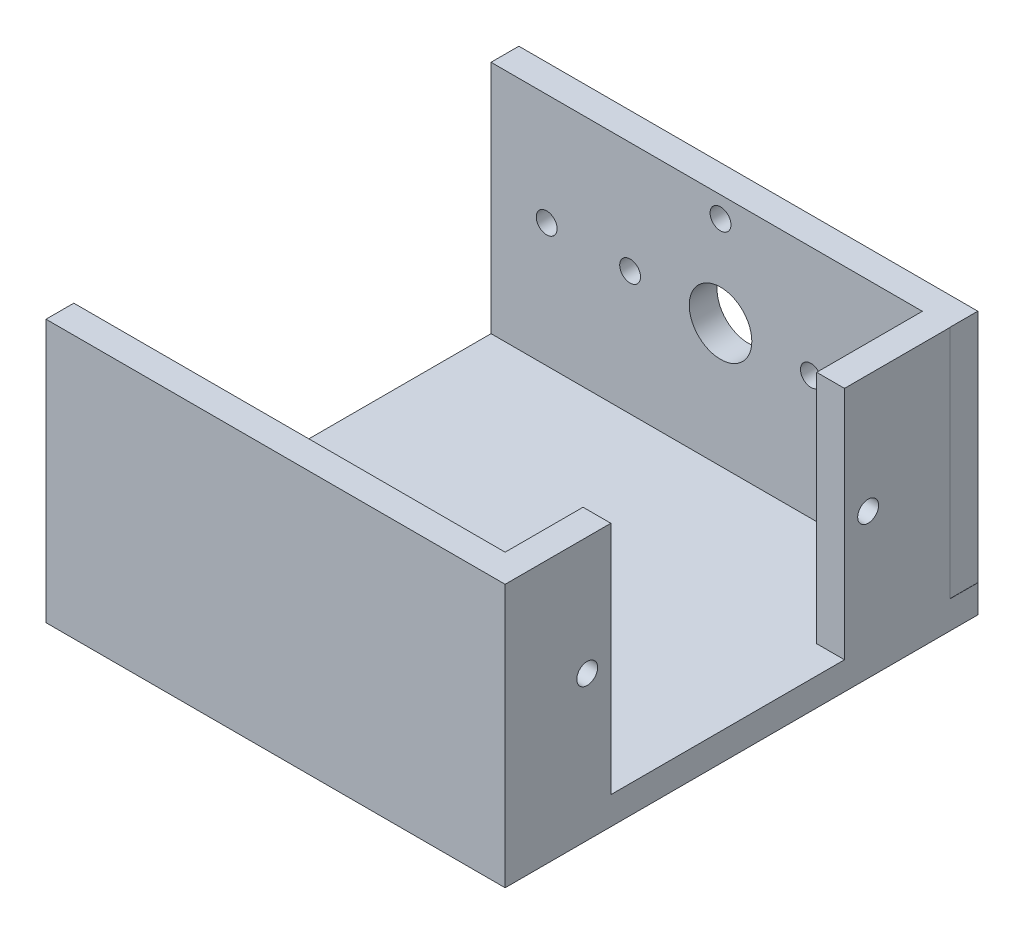
ISO-10303-21;
HEADER;
FILE_DESCRIPTION(('STEP AP214'),'2;1');
FILE_NAME('part.step','',(''),(''),'','','');
FILE_SCHEMA(('AUTOMOTIVE_DESIGN { 1 0 10303 214 1 1 1 1 }'));
ENDSEC;
DATA;
#1=APPLICATION_CONTEXT('core data for automotive mechanical design processes');
#2=APPLICATION_PROTOCOL_DEFINITION('international standard','automotive_design',2000,#1);
#3=PRODUCT_CONTEXT('',#1,'mechanical');
#4=PRODUCT('Part','Part','',(#3));
#5=PRODUCT_RELATED_PRODUCT_CATEGORY('part','',(#4));
#6=PRODUCT_DEFINITION_FORMATION('','',#4);
#7=PRODUCT_DEFINITION_CONTEXT('part definition',#1,'design');
#8=PRODUCT_DEFINITION('design','',#6,#7);
#9=PRODUCT_DEFINITION_SHAPE('','',#8);
#10=(LENGTH_UNIT() NAMED_UNIT(*) SI_UNIT(.MILLI.,.METRE.));
#11=(NAMED_UNIT(*) PLANE_ANGLE_UNIT() SI_UNIT($,.RADIAN.));
#12=(NAMED_UNIT(*) SI_UNIT($,.STERADIAN.) SOLID_ANGLE_UNIT());
#13=UNCERTAINTY_MEASURE_WITH_UNIT(LENGTH_MEASURE(1.E-05),#10,'distance_accuracy_value','');
#14=(GEOMETRIC_REPRESENTATION_CONTEXT(3) GLOBAL_UNCERTAINTY_ASSIGNED_CONTEXT((#13)) GLOBAL_UNIT_ASSIGNED_CONTEXT((#10,
#11,#12)) REPRESENTATION_CONTEXT('',''));
#15=CARTESIAN_POINT('',(0.,0.,0.));
#16=DIRECTION('',(0.,0.,1.));
#17=DIRECTION('',(1.,0.,0.));
#18=AXIS2_PLACEMENT_3D('',#15,#16,#17);
#19=CARTESIAN_POINT('',(0.,0.,2.));
#20=DIRECTION('',(0.,0.,-1.));
#21=DIRECTION('',(-1.,0.,0.));
#22=AXIS2_PLACEMENT_3D('',#19,#20,#21);
#23=PLANE('',#22);
#24=CARTESIAN_POINT('',(12.5,10.9,2.));
#25=DIRECTION('',(0.,0.,1.));
#26=DIRECTION('',(-1.,0.,0.));
#27=AXIS2_PLACEMENT_3D('',#24,#25,#26);
#28=CIRCLE('',#27,0.75);
#29=CARTESIAN_POINT('',(11.75,10.9,2.));
#30=VERTEX_POINT('',#29);
#31=EDGE_CURVE('E307',#30,#30,#28,.T.);
#32=ORIENTED_EDGE('',*,*,#31,.F.);
#33=EDGE_LOOP('',(#32));
#34=FACE_BOUND('',#33,.T.);
#35=CARTESIAN_POINT('',(6.5,10.9,2.));
#36=DIRECTION('',(0.,0.,1.));
#37=DIRECTION('',(-1.,0.,0.));
#38=AXIS2_PLACEMENT_3D('',#35,#36,#37);
#39=CIRCLE('',#38,0.750000000000001);
#40=CARTESIAN_POINT('',(5.74999999999999,10.9,2.));
#41=VERTEX_POINT('',#40);
#42=EDGE_CURVE('E315',#41,#41,#39,.T.);
#43=ORIENTED_EDGE('',*,*,#42,.F.);
#44=EDGE_LOOP('',(#43));
#45=FACE_BOUND('',#44,.T.);
#46=CARTESIAN_POINT('',(-12.5,10.9,2.));
#47=DIRECTION('',(0.,0.,1.));
#48=DIRECTION('',(1.,0.,0.));
#49=AXIS2_PLACEMENT_3D('',#46,#47,#48);
#50=CIRCLE('',#49,0.75);
#51=CARTESIAN_POINT('',(-11.75,10.9,2.));
#52=VERTEX_POINT('',#51);
#53=EDGE_CURVE('E323',#52,#52,#50,.T.);
#54=ORIENTED_EDGE('',*,*,#53,.F.);
#55=EDGE_LOOP('',(#54));
#56=FACE_BOUND('',#55,.T.);
#57=CARTESIAN_POINT('',(-6.5,10.9,2.));
#58=DIRECTION('',(0.,0.,1.));
#59=DIRECTION('',(1.,0.,0.));
#60=AXIS2_PLACEMENT_3D('',#57,#58,#59);
#61=CIRCLE('',#60,0.750000000000001);
#62=CARTESIAN_POINT('',(-5.75,10.9,2.));
#63=VERTEX_POINT('',#62);
#64=EDGE_CURVE('E331',#63,#63,#61,.T.);
#65=ORIENTED_EDGE('',*,*,#64,.F.);
#66=EDGE_LOOP('',(#65));
#67=FACE_BOUND('',#66,.T.);
#68=CARTESIAN_POINT('',(0.,17.4,2.));
#69=DIRECTION('',(0.,0.,1.));
#70=DIRECTION('',(1.,0.,0.));
#71=AXIS2_PLACEMENT_3D('',#68,#69,#70);
#72=CIRCLE('',#71,0.750000000000001);
#73=CARTESIAN_POINT('',(0.749999999999997,17.4,2.));
#74=VERTEX_POINT('',#73);
#75=EDGE_CURVE('E339',#74,#74,#72,.T.);
#76=ORIENTED_EDGE('',*,*,#75,.F.);
#77=EDGE_LOOP('',(#76));
#78=FACE_BOUND('',#77,.T.);
#79=CARTESIAN_POINT('',(0.,10.9,2.));
#80=DIRECTION('',(0.,0.,1.));
#81=DIRECTION('',(1.,0.,0.));
#82=AXIS2_PLACEMENT_3D('',#79,#80,#81);
#83=CIRCLE('',#82,2.25);
#84=CARTESIAN_POINT('',(2.25,10.9,2.));
#85=VERTEX_POINT('',#84);
#86=EDGE_CURVE('E347',#85,#85,#83,.T.);
#87=ORIENTED_EDGE('',*,*,#86,.F.);
#88=EDGE_LOOP('',(#87));
#89=FACE_BOUND('',#88,.T.);
#90=DIRECTION('',(0.,1.,0.));
#91=VECTOR('',#90,1.);
#92=CARTESIAN_POINT('',(14.5141570978995,2.,2.));
#93=LINE('',#92,#91);
#94=CARTESIAN_POINT('',(14.5141570978995,2.,2.));
#95=VERTEX_POINT('',#94);
#96=CARTESIAN_POINT('',(14.5141570978995,18.9,2.));
#97=VERTEX_POINT('',#96);
#98=EDGE_CURVE('E222',#95,#97,#93,.T.);
#99=ORIENTED_EDGE('',*,*,#98,.T.);
#100=DIRECTION('',(-1.,0.,0.));
#101=VECTOR('',#100,1.);
#102=CARTESIAN_POINT('',(-16.5,18.9,2.));
#103=LINE('',#102,#101);
#104=CARTESIAN_POINT('',(-16.5,18.9,2.));
#105=VERTEX_POINT('',#104);
#106=EDGE_CURVE('E361',#97,#105,#103,.T.);
#107=ORIENTED_EDGE('',*,*,#106,.T.);
#108=DIRECTION('',(0.,-1.,0.));
#109=VECTOR('',#108,1.);
#110=CARTESIAN_POINT('',(-16.5,0.,2.));
#111=LINE('',#110,#109);
#112=CARTESIAN_POINT('',(-16.5,2.,2.));
#113=VERTEX_POINT('',#112);
#114=EDGE_CURVE('E73',#105,#113,#111,.T.);
#115=ORIENTED_EDGE('',*,*,#114,.T.);
#116=DIRECTION('',(1.,0.,0.));
#117=VECTOR('',#116,1.);
#118=CARTESIAN_POINT('',(0.,2.,2.));
#119=LINE('',#118,#117);
#120=EDGE_CURVE('E303',#113,#95,#119,.T.);
#121=ORIENTED_EDGE('',*,*,#120,.T.);
#122=EDGE_LOOP('',(#99,#107,#115,#121));
#123=FACE_BOUND('',#122,.T.);
#124=ADVANCED_FACE('F49',(#34,#45,#56,#67,#78,#89,#123),#23,.F.);
#125=CARTESIAN_POINT('',(0.,2.,0.));
#126=DIRECTION('',(0.,1.,0.));
#127=DIRECTION('',(0.,0.,1.));
#128=AXIS2_PLACEMENT_3D('',#125,#126,#127);
#129=PLANE('',#128);
#130=DIRECTION('',(1.,0.,0.));
#131=VECTOR('',#130,1.);
#132=CARTESIAN_POINT('',(14.5141570978995,2.,2.));
#133=LINE('',#132,#131);
#134=CARTESIAN_POINT('',(16.5,2.,2.));
#135=VERTEX_POINT('',#134);
#136=CARTESIAN_POINT('',(16.5141570978995,2.,2.));
#137=VERTEX_POINT('',#136);
#138=EDGE_CURVE('E205',#135,#137,#133,.T.);
#139=ORIENTED_EDGE('',*,*,#138,.T.);
#140=DIRECTION('',(0.,0.,1.));
#141=VECTOR('',#140,1.);
#142=CARTESIAN_POINT('',(16.5141570978995,2.,0.));
#143=LINE('',#142,#141);
#144=CARTESIAN_POINT('',(16.5141570978995,2.,0.));
#145=VERTEX_POINT('',#144);
#146=EDGE_CURVE('E289',#145,#137,#143,.T.);
#147=ORIENTED_EDGE('',*,*,#146,.F.);
#148=DIRECTION('',(1.,0.,0.));
#149=VECTOR('',#148,1.);
#150=CARTESIAN_POINT('',(-16.5,2.,0.));
#151=LINE('',#150,#149);
#152=CARTESIAN_POINT('',(16.5,2.,0.));
#153=VERTEX_POINT('',#152);
#154=EDGE_CURVE('E285',#153,#145,#151,.T.);
#155=ORIENTED_EDGE('',*,*,#154,.F.);
#156=DIRECTION('',(0.,0.,-1.));
#157=VECTOR('',#156,1.);
#158=CARTESIAN_POINT('',(16.5,2.,2.));
#159=LINE('',#158,#157);
#160=EDGE_CURVE('E11',#135,#153,#159,.T.);
#161=ORIENTED_EDGE('',*,*,#160,.F.);
#162=EDGE_LOOP('',(#139,#147,#155,#161));
#163=FACE_BOUND('',#162,.T.);
#164=ADVANCED_FACE('F399',(#163),#129,.T.);
#165=CARTESIAN_POINT('',(0.,0.,0.));
#166=DIRECTION('',(0.,0.,-1.));
#167=DIRECTION('',(-1.,0.,0.));
#168=AXIS2_PLACEMENT_3D('',#165,#166,#167);
#169=PLANE('',#168);
#170=DIRECTION('',(0.,1.,0.));
#171=VECTOR('',#170,1.);
#172=CARTESIAN_POINT('',(16.5,0.,0.));
#173=LINE('',#172,#171);
#174=CARTESIAN_POINT('',(16.5,18.9,0.));
#175=VERTEX_POINT('',#174);
#176=EDGE_CURVE('E370',#153,#175,#173,.T.);
#177=ORIENTED_EDGE('',*,*,#176,.F.);
#178=ORIENTED_EDGE('',*,*,#154,.T.);
#179=DIRECTION('',(0.,-1.,0.));
#180=VECTOR('',#179,1.);
#181=CARTESIAN_POINT('',(16.5141570978995,2.,0.));
#182=LINE('',#181,#180);
#183=CARTESIAN_POINT('',(16.5141570978995,0.,0.));
#184=VERTEX_POINT('',#183);
#185=EDGE_CURVE('E297',#145,#184,#182,.T.);
#186=ORIENTED_EDGE('',*,*,#185,.T.);
#187=DIRECTION('',(1.,0.,0.));
#188=VECTOR('',#187,1.);
#189=CARTESIAN_POINT('',(-16.5,0.,0.));
#190=LINE('',#189,#188);
#191=CARTESIAN_POINT('',(-16.5,0.,0.));
#192=VERTEX_POINT('',#191);
#193=EDGE_CURVE('E367',#192,#184,#190,.T.);
#194=ORIENTED_EDGE('',*,*,#193,.F.);
#195=DIRECTION('',(0.,-1.,0.));
#196=VECTOR('',#195,1.);
#197=CARTESIAN_POINT('',(-16.5,0.,0.));
#198=LINE('',#197,#196);
#199=CARTESIAN_POINT('',(-16.5,18.9,0.));
#200=VERTEX_POINT('',#199);
#201=EDGE_CURVE('E351',#200,#192,#198,.T.);
#202=ORIENTED_EDGE('',*,*,#201,.F.);
#203=DIRECTION('',(-1.,0.,0.));
#204=VECTOR('',#203,1.);
#205=CARTESIAN_POINT('',(-16.5,18.9,0.));
#206=LINE('',#205,#204);
#207=EDGE_CURVE('E358',#175,#200,#206,.T.);
#208=ORIENTED_EDGE('',*,*,#207,.F.);
#209=EDGE_LOOP('',(#177,#178,#186,#194,#202,#208));
#210=FACE_BOUND('',#209,.T.);
#211=CARTESIAN_POINT('',(6.5,10.9,0.));
#212=DIRECTION('',(0.,0.,1.));
#213=DIRECTION('',(-1.,0.,0.));
#214=AXIS2_PLACEMENT_3D('',#211,#212,#213);
#215=CIRCLE('',#214,0.750000000000001);
#216=CARTESIAN_POINT('',(5.74999999999999,10.9,0.));
#217=VERTEX_POINT('',#216);
#218=EDGE_CURVE('E311',#217,#217,#215,.T.);
#219=ORIENTED_EDGE('',*,*,#218,.T.);
#220=EDGE_LOOP('',(#219));
#221=FACE_BOUND('',#220,.T.);
#222=CARTESIAN_POINT('',(-6.5,10.9,0.));
#223=DIRECTION('',(0.,0.,1.));
#224=DIRECTION('',(1.,0.,0.));
#225=AXIS2_PLACEMENT_3D('',#222,#223,#224);
#226=CIRCLE('',#225,0.750000000000001);
#227=CARTESIAN_POINT('',(-5.75,10.9,0.));
#228=VERTEX_POINT('',#227);
#229=EDGE_CURVE('E327',#228,#228,#226,.T.);
#230=ORIENTED_EDGE('',*,*,#229,.T.);
#231=EDGE_LOOP('',(#230));
#232=FACE_BOUND('',#231,.T.);
#233=CARTESIAN_POINT('',(0.,10.9,0.));
#234=DIRECTION('',(0.,0.,1.));
#235=DIRECTION('',(1.,0.,0.));
#236=AXIS2_PLACEMENT_3D('',#233,#234,#235);
#237=CIRCLE('',#236,2.25);
#238=CARTESIAN_POINT('',(2.25,10.9,0.));
#239=VERTEX_POINT('',#238);
#240=EDGE_CURVE('E343',#239,#239,#237,.T.);
#241=ORIENTED_EDGE('',*,*,#240,.T.);
#242=EDGE_LOOP('',(#241));
#243=FACE_BOUND('',#242,.T.);
#244=CARTESIAN_POINT('',(0.,17.4,0.));
#245=DIRECTION('',(0.,0.,1.));
#246=DIRECTION('',(1.,0.,0.));
#247=AXIS2_PLACEMENT_3D('',#244,#245,#246);
#248=CIRCLE('',#247,0.750000000000001);
#249=CARTESIAN_POINT('',(0.749999999999997,17.4,0.));
#250=VERTEX_POINT('',#249);
#251=EDGE_CURVE('E335',#250,#250,#248,.T.);
#252=ORIENTED_EDGE('',*,*,#251,.T.);
#253=EDGE_LOOP('',(#252));
#254=FACE_BOUND('',#253,.T.);
#255=CARTESIAN_POINT('',(-12.5,10.9,0.));
#256=DIRECTION('',(0.,0.,1.));
#257=DIRECTION('',(1.,0.,0.));
#258=AXIS2_PLACEMENT_3D('',#255,#256,#257);
#259=CIRCLE('',#258,0.75);
#260=CARTESIAN_POINT('',(-11.75,10.9,0.));
#261=VERTEX_POINT('',#260);
#262=EDGE_CURVE('E319',#261,#261,#259,.T.);
#263=ORIENTED_EDGE('',*,*,#262,.T.);
#264=EDGE_LOOP('',(#263));
#265=FACE_BOUND('',#264,.T.);
#266=CARTESIAN_POINT('',(12.5,10.9,0.));
#267=DIRECTION('',(0.,0.,1.));
#268=DIRECTION('',(-1.,0.,0.));
#269=AXIS2_PLACEMENT_3D('',#266,#267,#268);
#270=CIRCLE('',#269,0.75);
#271=CARTESIAN_POINT('',(11.75,10.9,0.));
#272=VERTEX_POINT('',#271);
#273=EDGE_CURVE('E306',#272,#272,#270,.T.);
#274=ORIENTED_EDGE('',*,*,#273,.T.);
#275=EDGE_LOOP('',(#274));
#276=FACE_BOUND('',#275,.T.);
#277=ADVANCED_FACE('F393',(#210,#221,#232,#243,#254,#265,#276),#169,.T.);
#278=CARTESIAN_POINT('',(-16.5,0.,2.));
#279=DIRECTION('',(1.,0.,0.));
#280=DIRECTION('',(0.,0.,-1.));
#281=AXIS2_PLACEMENT_3D('',#278,#279,#280);
#282=PLANE('',#281);
#283=ORIENTED_EDGE('',*,*,#201,.T.);
#284=DIRECTION('',(0.,0.,-1.));
#285=VECTOR('',#284,1.);
#286=CARTESIAN_POINT('',(-16.5,0.,2.));
#287=LINE('',#286,#285);
#288=CARTESIAN_POINT('',(-16.5,0.,34.));
#289=VERTEX_POINT('',#288);
#290=EDGE_CURVE('E58',#289,#192,#287,.T.);
#291=ORIENTED_EDGE('',*,*,#290,.F.);
#292=DIRECTION('',(0.,-1.,0.));
#293=VECTOR('',#292,1.);
#294=CARTESIAN_POINT('',(-16.5,0.,34.));
#295=LINE('',#294,#293);
#296=CARTESIAN_POINT('',(-16.5,18.9,34.));
#297=VERTEX_POINT('',#296);
#298=EDGE_CURVE('E180',#297,#289,#295,.T.);
#299=ORIENTED_EDGE('',*,*,#298,.F.);
#300=DIRECTION('',(0.,0.,-1.));
#301=VECTOR('',#300,1.);
#302=CARTESIAN_POINT('',(-16.5,18.9,34.));
#303=LINE('',#302,#301);
#304=CARTESIAN_POINT('',(-16.5,18.9,32.));
#305=VERTEX_POINT('',#304);
#306=EDGE_CURVE('E175',#297,#305,#303,.T.);
#307=ORIENTED_EDGE('',*,*,#306,.T.);
#308=DIRECTION('',(0.,-1.,0.));
#309=VECTOR('',#308,1.);
#310=CARTESIAN_POINT('',(-16.5,0.,32.));
#311=LINE('',#310,#309);
#312=CARTESIAN_POINT('',(-16.5,2.,32.));
#313=VERTEX_POINT('',#312);
#314=EDGE_CURVE('E187',#305,#313,#311,.T.);
#315=ORIENTED_EDGE('',*,*,#314,.T.);
#316=DIRECTION('',(0.,0.,-1.));
#317=VECTOR('',#316,1.);
#318=CARTESIAN_POINT('',(-16.5,2.,0.));
#319=LINE('',#318,#317);
#320=EDGE_CURVE('E281',#313,#113,#319,.T.);
#321=ORIENTED_EDGE('',*,*,#320,.T.);
#322=ORIENTED_EDGE('',*,*,#114,.F.);
#323=DIRECTION('',(0.,0.,-1.));
#324=VECTOR('',#323,1.);
#325=CARTESIAN_POINT('',(-16.5,18.9,2.));
#326=LINE('',#325,#324);
#327=EDGE_CURVE('E364',#105,#200,#326,.T.);
#328=ORIENTED_EDGE('',*,*,#327,.T.);
#329=EDGE_LOOP('',(#283,#291,#299,#307,#315,#321,#322,#328));
#330=FACE_BOUND('',#329,.T.);
#331=ADVANCED_FACE('F51',(#330),#282,.F.);
#332=CARTESIAN_POINT('',(-16.5,0.,2.));
#333=DIRECTION('',(0.,1.,0.));
#334=DIRECTION('',(0.,0.,1.));
#335=AXIS2_PLACEMENT_3D('',#332,#333,#334);
#336=PLANE('',#335);
#337=ORIENTED_EDGE('',*,*,#193,.T.);
#338=DIRECTION('',(0.,0.,1.));
#339=VECTOR('',#338,1.);
#340=CARTESIAN_POINT('',(16.5141570978995,0.,0.));
#341=LINE('',#340,#339);
#342=CARTESIAN_POINT('',(16.5141570978995,0.,34.));
#343=VERTEX_POINT('',#342);
#344=EDGE_CURVE('E277',#184,#343,#341,.T.);
#345=ORIENTED_EDGE('',*,*,#344,.T.);
#346=DIRECTION('',(1.,0.,0.));
#347=VECTOR('',#346,1.);
#348=CARTESIAN_POINT('',(16.5141570978995,0.,34.));
#349=LINE('',#348,#347);
#350=EDGE_CURVE('E185',#289,#343,#349,.T.);
#351=ORIENTED_EDGE('',*,*,#350,.F.);
#352=ORIENTED_EDGE('',*,*,#290,.T.);
#353=EDGE_LOOP('',(#337,#345,#351,#352));
#354=FACE_BOUND('',#353,.T.);
#355=ADVANCED_FACE('F385',(#354),#336,.F.);
#356=CARTESIAN_POINT('',(16.5,0.,2.));
#357=DIRECTION('',(-1.,0.,0.));
#358=DIRECTION('',(0.,0.,1.));
#359=AXIS2_PLACEMENT_3D('',#356,#357,#358);
#360=PLANE('',#359);
#361=DIRECTION('',(0.,1.,0.));
#362=VECTOR('',#361,1.);
#363=CARTESIAN_POINT('',(16.5,0.,2.));
#364=LINE('',#363,#362);
#365=CARTESIAN_POINT('',(16.5,18.9,2.));
#366=VERTEX_POINT('',#365);
#367=EDGE_CURVE('E357',#135,#366,#364,.T.);
#368=ORIENTED_EDGE('',*,*,#367,.F.);
#369=ORIENTED_EDGE('',*,*,#160,.T.);
#370=ORIENTED_EDGE('',*,*,#176,.T.);
#371=DIRECTION('',(0.,0.,-1.));
#372=VECTOR('',#371,1.);
#373=CARTESIAN_POINT('',(16.5,18.9,2.));
#374=LINE('',#373,#372);
#375=EDGE_CURVE('E378',#366,#175,#374,.T.);
#376=ORIENTED_EDGE('',*,*,#375,.F.);
#377=EDGE_LOOP('',(#368,#369,#370,#376));
#378=FACE_BOUND('',#377,.T.);
#379=ADVANCED_FACE('F407',(#378),#360,.F.);
#380=CARTESIAN_POINT('',(-16.5,18.9,2.));
#381=DIRECTION('',(0.,-1.,0.));
#382=DIRECTION('',(0.,0.,-1.));
#383=AXIS2_PLACEMENT_3D('',#380,#381,#382);
#384=PLANE('',#383);
#385=ORIENTED_EDGE('',*,*,#207,.T.);
#386=ORIENTED_EDGE('',*,*,#327,.F.);
#387=ORIENTED_EDGE('',*,*,#106,.F.);
#388=DIRECTION('',(0.,0.,1.));
#389=VECTOR('',#388,1.);
#390=CARTESIAN_POINT('',(14.5141570978995,18.9,2.));
#391=LINE('',#390,#389);
#392=CARTESIAN_POINT('',(14.5141570978995,18.9,9.6));
#393=VERTEX_POINT('',#392);
#394=EDGE_CURVE('E235',#97,#393,#391,.T.);
#395=ORIENTED_EDGE('',*,*,#394,.T.);
#396=DIRECTION('',(1.,0.,0.));
#397=VECTOR('',#396,1.);
#398=CARTESIAN_POINT('',(14.5141570978995,18.9,9.6));
#399=LINE('',#398,#397);
#400=CARTESIAN_POINT('',(16.5141570978995,18.9,9.6));
#401=VERTEX_POINT('',#400);
#402=EDGE_CURVE('E210',#393,#401,#399,.T.);
#403=ORIENTED_EDGE('',*,*,#402,.T.);
#404=DIRECTION('',(0.,0.,1.));
#405=VECTOR('',#404,1.);
#406=CARTESIAN_POINT('',(16.5141570978995,18.9,2.));
#407=LINE('',#406,#405);
#408=CARTESIAN_POINT('',(16.5141570978995,18.9,2.));
#409=VERTEX_POINT('',#408);
#410=EDGE_CURVE('E221',#409,#401,#407,.T.);
#411=ORIENTED_EDGE('',*,*,#410,.F.);
#412=DIRECTION('',(1.,0.,0.));
#413=VECTOR('',#412,1.);
#414=CARTESIAN_POINT('',(14.5141570978995,18.9,2.));
#415=LINE('',#414,#413);
#416=EDGE_CURVE('E206',#366,#409,#415,.T.);
#417=ORIENTED_EDGE('',*,*,#416,.F.);
#418=ORIENTED_EDGE('',*,*,#375,.T.);
#419=EDGE_LOOP('',(#385,#386,#387,#395,#403,#411,#417,#418));
#420=FACE_BOUND('',#419,.T.);
#421=ADVANCED_FACE('F409',(#420),#384,.F.);
#422=CARTESIAN_POINT('',(0.,10.9,2.));
#423=DIRECTION('',(0.,0.,-1.));
#424=DIRECTION('',(-1.,0.,0.));
#425=AXIS2_PLACEMENT_3D('',#422,#423,#424);
#426=CYLINDRICAL_SURFACE('',#425,2.25);
#427=ORIENTED_EDGE('',*,*,#86,.T.);
#428=EDGE_LOOP('',(#427));
#429=FACE_BOUND('',#428,.T.);
#430=ORIENTED_EDGE('',*,*,#240,.F.);
#431=EDGE_LOOP('',(#430));
#432=FACE_BOUND('',#431,.T.);
#433=ADVANCED_FACE('F514',(#429,#432),#426,.F.);
#434=CARTESIAN_POINT('',(0.,17.4,2.));
#435=DIRECTION('',(0.,0.,-1.));
#436=DIRECTION('',(-1.,0.,0.));
#437=AXIS2_PLACEMENT_3D('',#434,#435,#436);
#438=CYLINDRICAL_SURFACE('',#437,0.750000000000001);
#439=ORIENTED_EDGE('',*,*,#75,.T.);
#440=EDGE_LOOP('',(#439));
#441=FACE_BOUND('',#440,.T.);
#442=ORIENTED_EDGE('',*,*,#251,.F.);
#443=EDGE_LOOP('',(#442));
#444=FACE_BOUND('',#443,.T.);
#445=ADVANCED_FACE('F590',(#441,#444),#438,.F.);
#446=CARTESIAN_POINT('',(-6.5,10.9,2.));
#447=DIRECTION('',(0.,0.,-1.));
#448=DIRECTION('',(-1.,0.,0.));
#449=AXIS2_PLACEMENT_3D('',#446,#447,#448);
#450=CYLINDRICAL_SURFACE('',#449,0.750000000000001);
#451=ORIENTED_EDGE('',*,*,#64,.T.);
#452=EDGE_LOOP('',(#451));
#453=FACE_BOUND('',#452,.T.);
#454=ORIENTED_EDGE('',*,*,#229,.F.);
#455=EDGE_LOOP('',(#454));
#456=FACE_BOUND('',#455,.T.);
#457=ADVANCED_FACE('F579',(#453,#456),#450,.F.);
#458=CARTESIAN_POINT('',(-12.5,10.9,2.));
#459=DIRECTION('',(0.,0.,-1.));
#460=DIRECTION('',(-1.,0.,0.));
#461=AXIS2_PLACEMENT_3D('',#458,#459,#460);
#462=CYLINDRICAL_SURFACE('',#461,0.75);
#463=ORIENTED_EDGE('',*,*,#53,.T.);
#464=EDGE_LOOP('',(#463));
#465=FACE_BOUND('',#464,.T.);
#466=ORIENTED_EDGE('',*,*,#262,.F.);
#467=EDGE_LOOP('',(#466));
#468=FACE_BOUND('',#467,.T.);
#469=ADVANCED_FACE('F568',(#465,#468),#462,.F.);
#470=CARTESIAN_POINT('',(6.5,10.9,2.));
#471=DIRECTION('',(0.,0.,-1.));
#472=DIRECTION('',(-1.,0.,0.));
#473=AXIS2_PLACEMENT_3D('',#470,#471,#472);
#474=CYLINDRICAL_SURFACE('',#473,0.750000000000001);
#475=ORIENTED_EDGE('',*,*,#42,.T.);
#476=EDGE_LOOP('',(#475));
#477=FACE_BOUND('',#476,.T.);
#478=ORIENTED_EDGE('',*,*,#218,.F.);
#479=EDGE_LOOP('',(#478));
#480=FACE_BOUND('',#479,.T.);
#481=ADVANCED_FACE('F556',(#477,#480),#474,.F.);
#482=CARTESIAN_POINT('',(12.5,10.9,2.));
#483=DIRECTION('',(0.,0.,-1.));
#484=DIRECTION('',(-1.,0.,0.));
#485=AXIS2_PLACEMENT_3D('',#482,#483,#484);
#486=CYLINDRICAL_SURFACE('',#485,0.75);
#487=ORIENTED_EDGE('',*,*,#31,.T.);
#488=EDGE_LOOP('',(#487));
#489=FACE_BOUND('',#488,.T.);
#490=ORIENTED_EDGE('',*,*,#273,.F.);
#491=EDGE_LOOP('',(#490));
#492=FACE_BOUND('',#491,.T.);
#493=ADVANCED_FACE('F551',(#489,#492),#486,.F.);
#494=DIRECTION('',(1.,0.,0.));
#495=VECTOR('',#494,1.);
#496=CARTESIAN_POINT('',(14.5141570978995,2.,9.6));
#497=LINE('',#496,#495);
#498=CARTESIAN_POINT('',(14.5141570978995,2.,9.6));
#499=VERTEX_POINT('',#498);
#500=CARTESIAN_POINT('',(16.5141570978995,2.,9.6));
#501=VERTEX_POINT('',#500);
#502=EDGE_CURVE('E213',#499,#501,#497,.T.);
#503=ORIENTED_EDGE('',*,*,#502,.F.);
#504=DIRECTION('',(0.,0.,-1.));
#505=VECTOR('',#504,1.);
#506=CARTESIAN_POINT('',(14.5141570978995,2.,2.));
#507=LINE('',#506,#505);
#508=EDGE_CURVE('E209',#499,#95,#507,.T.);
#509=ORIENTED_EDGE('',*,*,#508,.T.);
#510=ORIENTED_EDGE('',*,*,#120,.F.);
#511=ORIENTED_EDGE('',*,*,#320,.F.);
#512=DIRECTION('',(-1.,0.,0.));
#513=VECTOR('',#512,1.);
#514=CARTESIAN_POINT('',(-16.5,2.,32.));
#515=LINE('',#514,#513);
#516=CARTESIAN_POINT('',(14.5141570978995,2.,32.));
#517=VERTEX_POINT('',#516);
#518=EDGE_CURVE('E293',#517,#313,#515,.T.);
#519=ORIENTED_EDGE('',*,*,#518,.F.);
#520=DIRECTION('',(0.,0.,-1.));
#521=VECTOR('',#520,1.);
#522=CARTESIAN_POINT('',(14.5141570978995,2.,32.));
#523=LINE('',#522,#521);
#524=CARTESIAN_POINT('',(14.5141570978995,2.,26.4));
#525=VERTEX_POINT('',#524);
#526=EDGE_CURVE('E259',#517,#525,#523,.T.);
#527=ORIENTED_EDGE('',*,*,#526,.T.);
#528=DIRECTION('',(1.,0.,0.));
#529=VECTOR('',#528,1.);
#530=CARTESIAN_POINT('',(14.5141570978995,2.,26.4));
#531=LINE('',#530,#529);
#532=CARTESIAN_POINT('',(16.5141570978995,2.,26.4));
#533=VERTEX_POINT('',#532);
#534=EDGE_CURVE('E271',#525,#533,#531,.T.);
#535=ORIENTED_EDGE('',*,*,#534,.T.);
#536=EDGE_CURVE('E288',#501,#533,#143,.T.);
#537=ORIENTED_EDGE('',*,*,#536,.F.);
#538=EDGE_LOOP('',(#503,#509,#510,#511,#519,#527,#535,#537));
#539=FACE_BOUND('',#538,.T.);
#540=ADVANCED_FACE('F419',(#539),#129,.T.);
#541=CARTESIAN_POINT('',(16.5141570978995,2.,0.));
#542=DIRECTION('',(1.,0.,0.));
#543=DIRECTION('',(0.,0.,-1.));
#544=AXIS2_PLACEMENT_3D('',#541,#542,#543);
#545=PLANE('',#544);
#546=ORIENTED_EDGE('',*,*,#344,.F.);
#547=ORIENTED_EDGE('',*,*,#185,.F.);
#548=ORIENTED_EDGE('',*,*,#146,.T.);
#549=DIRECTION('',(0.,1.,0.));
#550=VECTOR('',#549,1.);
#551=CARTESIAN_POINT('',(16.5141570978995,2.,2.));
#552=LINE('',#551,#550);
#553=EDGE_CURVE('E225',#137,#409,#552,.T.);
#554=ORIENTED_EDGE('',*,*,#553,.T.);
#555=ORIENTED_EDGE('',*,*,#410,.T.);
#556=DIRECTION('',(0.,-1.,0.));
#557=VECTOR('',#556,1.);
#558=CARTESIAN_POINT('',(16.5141570978995,2.,9.6));
#559=LINE('',#558,#557);
#560=EDGE_CURVE('E65',#401,#501,#559,.T.);
#561=ORIENTED_EDGE('',*,*,#560,.T.);
#562=ORIENTED_EDGE('',*,*,#536,.T.);
#563=DIRECTION('',(0.,1.,0.));
#564=VECTOR('',#563,1.);
#565=CARTESIAN_POINT('',(16.5141570978995,2.,26.4));
#566=LINE('',#565,#564);
#567=CARTESIAN_POINT('',(16.5141570978995,18.9,26.4));
#568=VERTEX_POINT('',#567);
#569=EDGE_CURVE('E166',#533,#568,#566,.T.);
#570=ORIENTED_EDGE('',*,*,#569,.T.);
#571=DIRECTION('',(0.,0.,1.));
#572=VECTOR('',#571,1.);
#573=CARTESIAN_POINT('',(16.5141570978995,18.9,32.));
#574=LINE('',#573,#572);
#575=CARTESIAN_POINT('',(16.5141570978995,18.9,34.));
#576=VERTEX_POINT('',#575);
#577=EDGE_CURVE('E158',#568,#576,#574,.T.);
#578=ORIENTED_EDGE('',*,*,#577,.T.);
#579=DIRECTION('',(0.,1.,0.));
#580=VECTOR('',#579,1.);
#581=CARTESIAN_POINT('',(16.5141570978995,0.,34.));
#582=LINE('',#581,#580);
#583=EDGE_CURVE('E164',#343,#576,#582,.T.);
#584=ORIENTED_EDGE('',*,*,#583,.F.);
#585=EDGE_LOOP('',(#546,#547,#548,#554,#555,#561,#562,#570,#578,#584));
#586=FACE_BOUND('',#585,.T.);
#587=CARTESIAN_POINT('',(16.5141570978995,10.4,28.1));
#588=DIRECTION('',(1.,0.,0.));
#589=DIRECTION('',(0.,0.,1.));
#590=AXIS2_PLACEMENT_3D('',#587,#588,#589);
#591=CIRCLE('',#590,0.750000000000002);
#592=CARTESIAN_POINT('',(16.5141570978995,10.4,28.85));
#593=VERTEX_POINT('',#592);
#594=EDGE_CURVE('E246',#593,#593,#591,.T.);
#595=ORIENTED_EDGE('',*,*,#594,.F.);
#596=EDGE_LOOP('',(#595));
#597=FACE_BOUND('',#596,.T.);
#598=CARTESIAN_POINT('',(16.5141570978995,10.4,7.9));
#599=DIRECTION('',(1.,0.,0.));
#600=DIRECTION('',(0.,0.,-1.));
#601=AXIS2_PLACEMENT_3D('',#598,#599,#600);
#602=CIRCLE('',#601,0.75);
#603=CARTESIAN_POINT('',(16.5141570978995,10.4,7.15));
#604=VERTEX_POINT('',#603);
#605=EDGE_CURVE('E242',#604,#604,#602,.T.);
#606=ORIENTED_EDGE('',*,*,#605,.F.);
#607=EDGE_LOOP('',(#606));
#608=FACE_BOUND('',#607,.T.);
#609=ADVANCED_FACE('F161',(#586,#597,#608),#545,.T.);
#610=CARTESIAN_POINT('',(14.5141570978995,18.9,32.));
#611=DIRECTION('',(0.,1.,0.));
#612=DIRECTION('',(0.,0.,1.));
#613=AXIS2_PLACEMENT_3D('',#610,#611,#612);
#614=PLANE('',#613);
#615=ORIENTED_EDGE('',*,*,#577,.F.);
#616=DIRECTION('',(1.,0.,0.));
#617=VECTOR('',#616,1.);
#618=CARTESIAN_POINT('',(14.5141570978995,18.9,26.4));
#619=LINE('',#618,#617);
#620=CARTESIAN_POINT('',(14.5141570978995,18.9,26.4));
#621=VERTEX_POINT('',#620);
#622=EDGE_CURVE('E274',#621,#568,#619,.T.);
#623=ORIENTED_EDGE('',*,*,#622,.F.);
#624=DIRECTION('',(0.,0.,1.));
#625=VECTOR('',#624,1.);
#626=CARTESIAN_POINT('',(14.5141570978995,18.9,32.));
#627=LINE('',#626,#625);
#628=CARTESIAN_POINT('',(14.5141570978995,18.9,32.));
#629=VERTEX_POINT('',#628);
#630=EDGE_CURVE('E267',#621,#629,#627,.T.);
#631=ORIENTED_EDGE('',*,*,#630,.T.);
#632=DIRECTION('',(-1.,0.,0.));
#633=VECTOR('',#632,1.);
#634=CARTESIAN_POINT('',(16.5141570978995,18.9,32.));
#635=LINE('',#634,#633);
#636=EDGE_CURVE('E194',#629,#305,#635,.T.);
#637=ORIENTED_EDGE('',*,*,#636,.T.);
#638=ORIENTED_EDGE('',*,*,#306,.F.);
#639=DIRECTION('',(-1.,0.,0.));
#640=VECTOR('',#639,1.);
#641=CARTESIAN_POINT('',(16.5141570978995,18.9,34.));
#642=LINE('',#641,#640);
#643=EDGE_CURVE('E172',#576,#297,#642,.T.);
#644=ORIENTED_EDGE('',*,*,#643,.F.);
#645=EDGE_LOOP('',(#615,#623,#631,#637,#638,#644));
#646=FACE_BOUND('',#645,.T.);
#647=ADVANCED_FACE('F173',(#646),#614,.T.);
#648=CARTESIAN_POINT('',(14.5141570978995,2.,26.4));
#649=DIRECTION('',(0.,0.,-1.));
#650=DIRECTION('',(0.,1.,0.));
#651=AXIS2_PLACEMENT_3D('',#648,#649,#650);
#652=PLANE('',#651);
#653=ORIENTED_EDGE('',*,*,#569,.F.);
#654=ORIENTED_EDGE('',*,*,#534,.F.);
#655=DIRECTION('',(0.,1.,0.));
#656=VECTOR('',#655,1.);
#657=CARTESIAN_POINT('',(14.5141570978995,2.,26.4));
#658=LINE('',#657,#656);
#659=EDGE_CURVE('E263',#525,#621,#658,.T.);
#660=ORIENTED_EDGE('',*,*,#659,.T.);
#661=ORIENTED_EDGE('',*,*,#622,.T.);
#662=EDGE_LOOP('',(#653,#654,#660,#661));
#663=FACE_BOUND('',#662,.T.);
#664=ADVANCED_FACE('F481',(#663),#652,.T.);
#665=CARTESIAN_POINT('',(14.5141570978995,0.,0.));
#666=DIRECTION('',(-1.,0.,0.));
#667=DIRECTION('',(0.,0.,1.));
#668=AXIS2_PLACEMENT_3D('',#665,#666,#667);
#669=PLANE('',#668);
#670=CARTESIAN_POINT('',(14.5141570978995,10.4,28.1));
#671=DIRECTION('',(1.,0.,0.));
#672=DIRECTION('',(0.,0.,1.));
#673=AXIS2_PLACEMENT_3D('',#670,#671,#672);
#674=CIRCLE('',#673,0.750000000000002);
#675=CARTESIAN_POINT('',(14.5141570978995,10.4,28.85));
#676=VERTEX_POINT('',#675);
#677=EDGE_CURVE('E250',#676,#676,#674,.T.);
#678=ORIENTED_EDGE('',*,*,#677,.T.);
#679=EDGE_LOOP('',(#678));
#680=FACE_BOUND('',#679,.T.);
#681=DIRECTION('',(0.,-1.,0.));
#682=VECTOR('',#681,1.);
#683=CARTESIAN_POINT('',(14.5141570978995,2.,32.));
#684=LINE('',#683,#682);
#685=EDGE_CURVE('E169',#629,#517,#684,.T.);
#686=ORIENTED_EDGE('',*,*,#685,.F.);
#687=ORIENTED_EDGE('',*,*,#630,.F.);
#688=ORIENTED_EDGE('',*,*,#659,.F.);
#689=ORIENTED_EDGE('',*,*,#526,.F.);
#690=EDGE_LOOP('',(#686,#687,#688,#689));
#691=FACE_BOUND('',#690,.T.);
#692=ADVANCED_FACE('F665',(#680,#691),#669,.T.);
#693=CARTESIAN_POINT('',(14.5141570978995,10.4,28.1));
#694=DIRECTION('',(1.,0.,0.));
#695=DIRECTION('',(0.,0.,-1.));
#696=AXIS2_PLACEMENT_3D('',#693,#694,#695);
#697=CYLINDRICAL_SURFACE('',#696,0.750000000000002);
#698=ORIENTED_EDGE('',*,*,#677,.F.);
#699=EDGE_LOOP('',(#698));
#700=FACE_BOUND('',#699,.T.);
#701=ORIENTED_EDGE('',*,*,#594,.T.);
#702=EDGE_LOOP('',(#701));
#703=FACE_BOUND('',#702,.T.);
#704=ADVANCED_FACE('F671',(#700,#703),#697,.F.);
#705=CARTESIAN_POINT('',(14.5141570978995,2.,2.));
#706=DIRECTION('',(0.,0.,-1.));
#707=DIRECTION('',(-1.,0.,0.));
#708=AXIS2_PLACEMENT_3D('',#705,#706,#707);
#709=PLANE('',#708);
#710=ORIENTED_EDGE('',*,*,#367,.T.);
#711=ORIENTED_EDGE('',*,*,#416,.T.);
#712=ORIENTED_EDGE('',*,*,#553,.F.);
#713=ORIENTED_EDGE('',*,*,#138,.F.);
#714=EDGE_LOOP('',(#710,#711,#712,#713));
#715=FACE_BOUND('',#714,.T.);
#716=ADVANCED_FACE('F403',(#715),#709,.T.);
#717=CARTESIAN_POINT('',(14.5141570978995,2.,9.6));
#718=DIRECTION('',(0.,0.,1.));
#719=DIRECTION('',(0.,-1.,0.));
#720=AXIS2_PLACEMENT_3D('',#717,#718,#719);
#721=PLANE('',#720);
#722=ORIENTED_EDGE('',*,*,#560,.F.);
#723=ORIENTED_EDGE('',*,*,#402,.F.);
#724=DIRECTION('',(0.,-1.,0.));
#725=VECTOR('',#724,1.);
#726=CARTESIAN_POINT('',(14.5141570978995,2.,9.6));
#727=LINE('',#726,#725);
#728=EDGE_CURVE('E232',#393,#499,#727,.T.);
#729=ORIENTED_EDGE('',*,*,#728,.T.);
#730=ORIENTED_EDGE('',*,*,#502,.T.);
#731=EDGE_LOOP('',(#722,#723,#729,#730));
#732=FACE_BOUND('',#731,.T.);
#733=ADVANCED_FACE('F414',(#732),#721,.T.);
#734=CARTESIAN_POINT('',(14.5141570978995,0.,0.));
#735=DIRECTION('',(1.,0.,0.));
#736=DIRECTION('',(0.,0.,-1.));
#737=AXIS2_PLACEMENT_3D('',#734,#735,#736);
#738=PLANE('',#737);
#739=CARTESIAN_POINT('',(14.5141570978995,10.4,7.9));
#740=DIRECTION('',(1.,0.,0.));
#741=DIRECTION('',(0.,0.,-1.));
#742=AXIS2_PLACEMENT_3D('',#739,#740,#741);
#743=CIRCLE('',#742,0.75);
#744=CARTESIAN_POINT('',(14.5141570978995,10.4,7.15));
#745=VERTEX_POINT('',#744);
#746=EDGE_CURVE('E229',#745,#745,#743,.T.);
#747=ORIENTED_EDGE('',*,*,#746,.T.);
#748=EDGE_LOOP('',(#747));
#749=FACE_BOUND('',#748,.T.);
#750=ORIENTED_EDGE('',*,*,#98,.F.);
#751=ORIENTED_EDGE('',*,*,#508,.F.);
#752=ORIENTED_EDGE('',*,*,#728,.F.);
#753=ORIENTED_EDGE('',*,*,#394,.F.);
#754=EDGE_LOOP('',(#750,#751,#752,#753));
#755=FACE_BOUND('',#754,.T.);
#756=ADVANCED_FACE('F491',(#749,#755),#738,.F.);
#757=CARTESIAN_POINT('',(14.5141570978995,10.4,7.9));
#758=DIRECTION('',(1.,0.,0.));
#759=DIRECTION('',(0.,0.,-1.));
#760=AXIS2_PLACEMENT_3D('',#757,#758,#759);
#761=CYLINDRICAL_SURFACE('',#760,0.75);
#762=ORIENTED_EDGE('',*,*,#746,.F.);
#763=EDGE_LOOP('',(#762));
#764=FACE_BOUND('',#763,.T.);
#765=ORIENTED_EDGE('',*,*,#605,.T.);
#766=EDGE_LOOP('',(#765));
#767=FACE_BOUND('',#766,.T.);
#768=ADVANCED_FACE('F493',(#764,#767),#761,.F.);
#769=CARTESIAN_POINT('',(0.,0.,32.));
#770=DIRECTION('',(0.,0.,1.));
#771=DIRECTION('',(1.,0.,0.));
#772=AXIS2_PLACEMENT_3D('',#769,#770,#771);
#773=PLANE('',#772);
#774=ORIENTED_EDGE('',*,*,#636,.F.);
#775=ORIENTED_EDGE('',*,*,#685,.T.);
#776=ORIENTED_EDGE('',*,*,#518,.T.);
#777=ORIENTED_EDGE('',*,*,#314,.F.);
#778=EDGE_LOOP('',(#774,#775,#776,#777));
#779=FACE_BOUND('',#778,.T.);
#780=ADVANCED_FACE('F488',(#779),#773,.F.);
#781=CARTESIAN_POINT('',(0.,0.,34.));
#782=DIRECTION('',(0.,0.,1.));
#783=DIRECTION('',(1.,0.,0.));
#784=AXIS2_PLACEMENT_3D('',#781,#782,#783);
#785=PLANE('',#784);
#786=ORIENTED_EDGE('',*,*,#583,.T.);
#787=ORIENTED_EDGE('',*,*,#643,.T.);
#788=ORIENTED_EDGE('',*,*,#298,.T.);
#789=ORIENTED_EDGE('',*,*,#350,.T.);
#790=EDGE_LOOP('',(#786,#787,#788,#789));
#791=FACE_BOUND('',#790,.T.);
#792=ADVANCED_FACE('F183',(#791),#785,.T.);
#793=CLOSED_SHELL('',(#124,#164,#277,#331,#355,#379,#421,#433,#445,#457,#469,#481,#493,#540,
#609,#647,#664,#692,#704,#716,#733,#756,#768,#780,#792));
#794=MANIFOLD_SOLID_BREP('B2',#793);
#795=ADVANCED_BREP_SHAPE_REPRESENTATION('',(#18,#794),#14);
#796=SHAPE_DEFINITION_REPRESENTATION(#9,#795);
ENDSEC;
END-ISO-10303-21;
